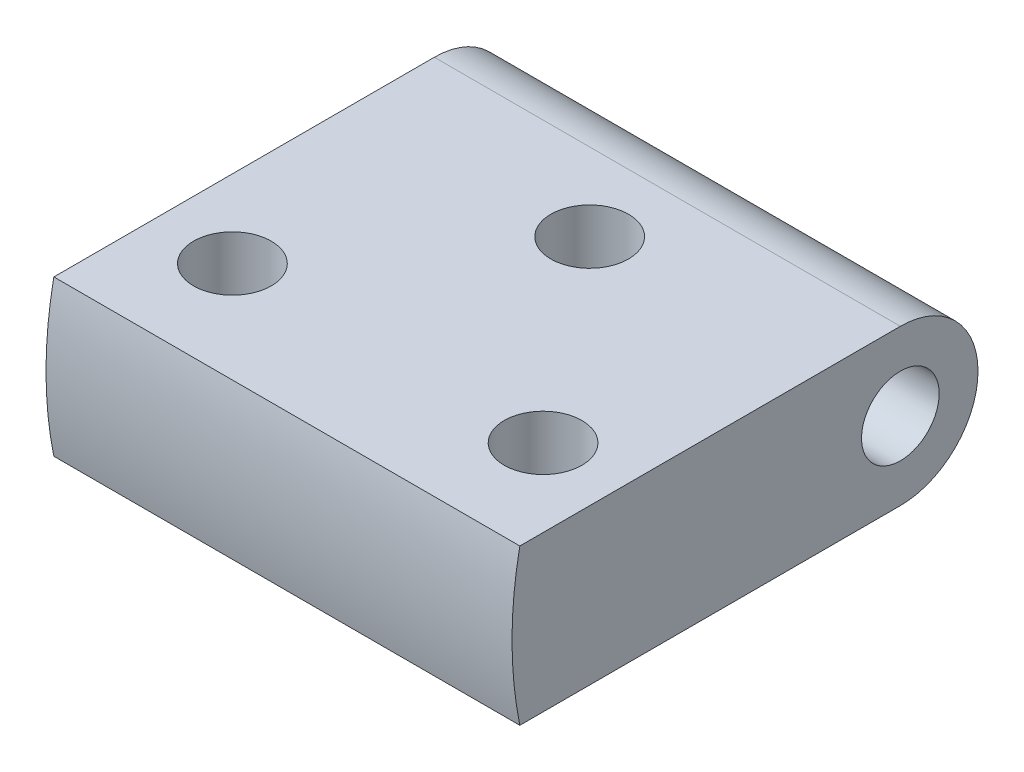
ISO-10303-21;
HEADER;
FILE_DESCRIPTION(('STEP AP214'),'2;1');
FILE_NAME('part.step','',(''),(''),'','','');
FILE_SCHEMA(('AUTOMOTIVE_DESIGN { 1 0 10303 214 1 1 1 1 }'));
ENDSEC;
DATA;
#1=APPLICATION_CONTEXT('core data for automotive mechanical design processes');
#2=APPLICATION_PROTOCOL_DEFINITION('international standard','automotive_design',2000,#1);
#3=PRODUCT_CONTEXT('',#1,'mechanical');
#4=PRODUCT('Part','Part','',(#3));
#5=PRODUCT_RELATED_PRODUCT_CATEGORY('part','',(#4));
#6=PRODUCT_DEFINITION_FORMATION('','',#4);
#7=PRODUCT_DEFINITION_CONTEXT('part definition',#1,'design');
#8=PRODUCT_DEFINITION('design','',#6,#7);
#9=PRODUCT_DEFINITION_SHAPE('','',#8);
#10=(LENGTH_UNIT() NAMED_UNIT(*) SI_UNIT(.MILLI.,.METRE.));
#11=(NAMED_UNIT(*) PLANE_ANGLE_UNIT() SI_UNIT($,.RADIAN.));
#12=(NAMED_UNIT(*) SI_UNIT($,.STERADIAN.) SOLID_ANGLE_UNIT());
#13=UNCERTAINTY_MEASURE_WITH_UNIT(LENGTH_MEASURE(1.E-05),#10,'distance_accuracy_value','');
#14=(GEOMETRIC_REPRESENTATION_CONTEXT(3) GLOBAL_UNCERTAINTY_ASSIGNED_CONTEXT((#13)) GLOBAL_UNIT_ASSIGNED_CONTEXT((#10,
#11,#12)) REPRESENTATION_CONTEXT('',''));
#15=CARTESIAN_POINT('',(0.,0.,0.));
#16=DIRECTION('',(0.,0.,1.));
#17=DIRECTION('',(1.,0.,0.));
#18=AXIS2_PLACEMENT_3D('',#15,#16,#17);
#19=CARTESIAN_POINT('',(15.,10.,15.));
#20=DIRECTION('',(-1.,0.,0.));
#21=DIRECTION('',(0.,0.,1.));
#22=AXIS2_PLACEMENT_3D('',#19,#20,#21);
#23=PLANE('',#22);
#24=CARTESIAN_POINT('',(15.,5.,-10.));
#25=DIRECTION('',(1.,0.,0.));
#26=DIRECTION('',(0.,0.,-1.));
#27=AXIS2_PLACEMENT_3D('',#24,#25,#26);
#28=CIRCLE('',#27,2.5);
#29=CARTESIAN_POINT('',(15.,5.,-12.5));
#30=VERTEX_POINT('',#29);
#31=EDGE_CURVE('E171',#30,#30,#28,.T.);
#32=ORIENTED_EDGE('',*,*,#31,.F.);
#33=EDGE_LOOP('',(#32));
#34=FACE_BOUND('',#33,.T.);
#35=CARTESIAN_POINT('',(15.,5.,-10.));
#36=DIRECTION('',(1.,0.,0.));
#37=DIRECTION('',(0.,0.,-1.));
#38=AXIS2_PLACEMENT_3D('',#35,#36,#37);
#39=CIRCLE('',#38,25.);
#40=CARTESIAN_POINT('',(15.,10.,14.4948974278318));
#41=VERTEX_POINT('',#40);
#42=CARTESIAN_POINT('',(15.,0.,14.4948974278318));
#43=VERTEX_POINT('',#42);
#44=EDGE_CURVE('E76',#41,#43,#39,.T.);
#45=ORIENTED_EDGE('',*,*,#44,.T.);
#46=DIRECTION('',(0.,0.,-1.));
#47=VECTOR('',#46,1.);
#48=CARTESIAN_POINT('',(15.,0.,15.));
#49=LINE('',#48,#47);
#50=CARTESIAN_POINT('',(15.,0.,-10.));
#51=VERTEX_POINT('',#50);
#52=EDGE_CURVE('E123',#43,#51,#49,.T.);
#53=ORIENTED_EDGE('',*,*,#52,.T.);
#54=CARTESIAN_POINT('',(15.,5.,-10.));
#55=DIRECTION('',(-1.,0.,0.));
#56=DIRECTION('',(0.,0.,1.));
#57=AXIS2_PLACEMENT_3D('',#54,#55,#56);
#58=CIRCLE('',#57,5.);
#59=CARTESIAN_POINT('',(15.,5.,-15.));
#60=VERTEX_POINT('',#59);
#61=EDGE_CURVE('E69',#51,#60,#58,.F.);
#62=ORIENTED_EDGE('',*,*,#61,.T.);
#63=CARTESIAN_POINT('',(15.,5.,-10.));
#64=DIRECTION('',(-1.,0.,0.));
#65=DIRECTION('',(0.,0.,1.));
#66=AXIS2_PLACEMENT_3D('',#63,#64,#65);
#67=CIRCLE('',#66,5.);
#68=CARTESIAN_POINT('',(15.,10.,-10.));
#69=VERTEX_POINT('',#68);
#70=EDGE_CURVE('E147',#60,#69,#67,.F.);
#71=ORIENTED_EDGE('',*,*,#70,.T.);
#72=DIRECTION('',(0.,0.,-1.));
#73=VECTOR('',#72,1.);
#74=CARTESIAN_POINT('',(15.,10.,15.));
#75=LINE('',#74,#73);
#76=EDGE_CURVE('E82',#41,#69,#75,.T.);
#77=ORIENTED_EDGE('',*,*,#76,.F.);
#78=EDGE_LOOP('',(#45,#53,#62,#71,#77));
#79=FACE_BOUND('',#78,.T.);
#80=ADVANCED_FACE('F59',(#34,#79),#23,.F.);
#81=CARTESIAN_POINT('',(-15.,10.,15.));
#82=DIRECTION('',(1.,0.,0.));
#83=DIRECTION('',(0.,0.,-1.));
#84=AXIS2_PLACEMENT_3D('',#81,#82,#83);
#85=PLANE('',#84);
#86=CARTESIAN_POINT('',(-15.,5.,-10.));
#87=DIRECTION('',(-1.,0.,0.));
#88=DIRECTION('',(0.,0.,1.));
#89=AXIS2_PLACEMENT_3D('',#86,#87,#88);
#90=CIRCLE('',#89,2.5);
#91=CARTESIAN_POINT('',(-15.,5.,-7.5));
#92=VERTEX_POINT('',#91);
#93=EDGE_CURVE('E322',#92,#92,#90,.T.);
#94=ORIENTED_EDGE('',*,*,#93,.F.);
#95=EDGE_LOOP('',(#94));
#96=FACE_BOUND('',#95,.T.);
#97=DIRECTION('',(0.,0.,1.));
#98=VECTOR('',#97,1.);
#99=CARTESIAN_POINT('',(-15.,0.,15.));
#100=LINE('',#99,#98);
#101=CARTESIAN_POINT('',(-15.,0.,-10.));
#102=VERTEX_POINT('',#101);
#103=CARTESIAN_POINT('',(-15.,0.,14.4948974278318));
#104=VERTEX_POINT('',#103);
#105=EDGE_CURVE('E121',#102,#104,#100,.T.);
#106=ORIENTED_EDGE('',*,*,#105,.T.);
#107=CARTESIAN_POINT('',(-15.,5.,-10.));
#108=DIRECTION('',(1.,0.,0.));
#109=DIRECTION('',(0.,0.,-1.));
#110=AXIS2_PLACEMENT_3D('',#107,#108,#109);
#111=CIRCLE('',#110,25.);
#112=CARTESIAN_POINT('',(-15.,10.,14.4948974278318));
#113=VERTEX_POINT('',#112);
#114=EDGE_CURVE('E105',#113,#104,#111,.T.);
#115=ORIENTED_EDGE('',*,*,#114,.F.);
#116=DIRECTION('',(0.,0.,1.));
#117=VECTOR('',#116,1.);
#118=CARTESIAN_POINT('',(-15.,10.,15.));
#119=LINE('',#118,#117);
#120=CARTESIAN_POINT('',(-15.,10.,-10.));
#121=VERTEX_POINT('',#120);
#122=EDGE_CURVE('E134',#121,#113,#119,.T.);
#123=ORIENTED_EDGE('',*,*,#122,.F.);
#124=CARTESIAN_POINT('',(-15.,5.,-10.));
#125=DIRECTION('',(1.,0.,0.));
#126=DIRECTION('',(0.,0.,-1.));
#127=AXIS2_PLACEMENT_3D('',#124,#125,#126);
#128=CIRCLE('',#127,5.);
#129=CARTESIAN_POINT('',(-15.,5.,-15.));
#130=VERTEX_POINT('',#129);
#131=EDGE_CURVE('E139',#121,#130,#128,.F.);
#132=ORIENTED_EDGE('',*,*,#131,.T.);
#133=CARTESIAN_POINT('',(-15.,5.,-10.));
#134=DIRECTION('',(1.,0.,0.));
#135=DIRECTION('',(0.,0.,-1.));
#136=AXIS2_PLACEMENT_3D('',#133,#134,#135);
#137=CIRCLE('',#136,5.);
#138=EDGE_CURVE('E129',#130,#102,#137,.F.);
#139=ORIENTED_EDGE('',*,*,#138,.T.);
#140=EDGE_LOOP('',(#106,#115,#123,#132,#139));
#141=FACE_BOUND('',#140,.T.);
#142=ADVANCED_FACE('F127',(#96,#141),#85,.F.);
#143=CARTESIAN_POINT('',(0.,0.,0.));
#144=DIRECTION('',(0.,-1.,0.));
#145=DIRECTION('',(0.,0.,-1.));
#146=AXIS2_PLACEMENT_3D('',#143,#144,#145);
#147=PLANE('',#146);
#148=CARTESIAN_POINT('',(-10.,0.,8.));
#149=DIRECTION('',(0.,-1.,0.));
#150=DIRECTION('',(0.,0.,-1.));
#151=AXIS2_PLACEMENT_3D('',#148,#149,#150);
#152=CIRCLE('',#151,2.25);
#153=CARTESIAN_POINT('',(-10.,0.,5.75));
#154=VERTEX_POINT('',#153);
#155=EDGE_CURVE('E193',#154,#154,#152,.T.);
#156=ORIENTED_EDGE('',*,*,#155,.F.);
#157=EDGE_LOOP('',(#156));
#158=FACE_BOUND('',#157,.T.);
#159=CARTESIAN_POINT('',(10.,0.,8.));
#160=DIRECTION('',(0.,-1.,0.));
#161=DIRECTION('',(0.,0.,-1.));
#162=AXIS2_PLACEMENT_3D('',#159,#160,#161);
#163=CIRCLE('',#162,2.25);
#164=CARTESIAN_POINT('',(10.,0.,5.75));
#165=VERTEX_POINT('',#164);
#166=EDGE_CURVE('E209',#165,#165,#163,.T.);
#167=ORIENTED_EDGE('',*,*,#166,.F.);
#168=EDGE_LOOP('',(#167));
#169=FACE_BOUND('',#168,.T.);
#170=CARTESIAN_POINT('',(0.,0.,-5.));
#171=DIRECTION('',(0.,-1.,0.));
#172=DIRECTION('',(0.,0.,-1.));
#173=AXIS2_PLACEMENT_3D('',#170,#171,#172);
#174=CIRCLE('',#173,2.25);
#175=CARTESIAN_POINT('',(0.,0.,-7.25));
#176=VERTEX_POINT('',#175);
#177=EDGE_CURVE('E225',#176,#176,#174,.T.);
#178=ORIENTED_EDGE('',*,*,#177,.F.);
#179=EDGE_LOOP('',(#178));
#180=FACE_BOUND('',#179,.T.);
#181=ORIENTED_EDGE('',*,*,#52,.F.);
#182=DIRECTION('',(1.,0.,0.));
#183=VECTOR('',#182,1.);
#184=CARTESIAN_POINT('',(-15.,0.,14.4948974278318));
#185=LINE('',#184,#183);
#186=EDGE_CURVE('E108',#104,#43,#185,.T.);
#187=ORIENTED_EDGE('',*,*,#186,.F.);
#188=ORIENTED_EDGE('',*,*,#105,.F.);
#189=DIRECTION('',(-1.,0.,0.));
#190=VECTOR('',#189,1.);
#191=CARTESIAN_POINT('',(15.,0.,-10.));
#192=LINE('',#191,#190);
#193=EDGE_CURVE('E144',#102,#51,#192,.F.);
#194=ORIENTED_EDGE('',*,*,#193,.T.);
#195=EDGE_LOOP('',(#181,#187,#188,#194));
#196=FACE_BOUND('',#195,.T.);
#197=ADVANCED_FACE('F119',(#158,#169,#180,#196),#147,.T.);
#198=CARTESIAN_POINT('',(0.,10.,0.));
#199=DIRECTION('',(0.,-1.,0.));
#200=DIRECTION('',(0.,0.,-1.));
#201=AXIS2_PLACEMENT_3D('',#198,#199,#200);
#202=PLANE('',#201);
#203=CARTESIAN_POINT('',(0.,10.,-5.));
#204=DIRECTION('',(0.,1.,0.));
#205=DIRECTION('',(0.,0.,1.));
#206=AXIS2_PLACEMENT_3D('',#203,#204,#205);
#207=CIRCLE('',#206,2.5);
#208=CARTESIAN_POINT('',(0.,10.,-2.5));
#209=VERTEX_POINT('',#208);
#210=EDGE_CURVE('E213',#209,#209,#207,.T.);
#211=ORIENTED_EDGE('',*,*,#210,.F.);
#212=EDGE_LOOP('',(#211));
#213=FACE_BOUND('',#212,.T.);
#214=CARTESIAN_POINT('',(10.,10.,8.));
#215=DIRECTION('',(0.,1.,0.));
#216=DIRECTION('',(0.,0.,1.));
#217=AXIS2_PLACEMENT_3D('',#214,#215,#216);
#218=CIRCLE('',#217,2.5);
#219=CARTESIAN_POINT('',(10.,10.,10.5));
#220=VERTEX_POINT('',#219);
#221=EDGE_CURVE('E197',#220,#220,#218,.T.);
#222=ORIENTED_EDGE('',*,*,#221,.F.);
#223=EDGE_LOOP('',(#222));
#224=FACE_BOUND('',#223,.T.);
#225=CARTESIAN_POINT('',(-10.,10.,8.));
#226=DIRECTION('',(0.,1.,0.));
#227=DIRECTION('',(0.,0.,1.));
#228=AXIS2_PLACEMENT_3D('',#225,#226,#227);
#229=CIRCLE('',#228,2.5);
#230=CARTESIAN_POINT('',(-10.,10.,10.5));
#231=VERTEX_POINT('',#230);
#232=EDGE_CURVE('E177',#231,#231,#229,.T.);
#233=ORIENTED_EDGE('',*,*,#232,.F.);
#234=EDGE_LOOP('',(#233));
#235=FACE_BOUND('',#234,.T.);
#236=DIRECTION('',(1.,0.,0.));
#237=VECTOR('',#236,1.);
#238=CARTESIAN_POINT('',(-15.,10.,14.4948974278318));
#239=LINE('',#238,#237);
#240=EDGE_CURVE('E110',#113,#41,#239,.T.);
#241=ORIENTED_EDGE('',*,*,#240,.T.);
#242=ORIENTED_EDGE('',*,*,#76,.T.);
#243=DIRECTION('',(-1.,0.,0.));
#244=VECTOR('',#243,1.);
#245=CARTESIAN_POINT('',(0.,10.,-10.));
#246=LINE('',#245,#244);
#247=EDGE_CURVE('E12',#69,#121,#246,.T.);
#248=ORIENTED_EDGE('',*,*,#247,.T.);
#249=ORIENTED_EDGE('',*,*,#122,.T.);
#250=EDGE_LOOP('',(#241,#242,#248,#249));
#251=FACE_BOUND('',#250,.T.);
#252=ADVANCED_FACE('F175',(#213,#224,#235,#251),#202,.F.);
#253=CARTESIAN_POINT('',(0.,5.,-10.));
#254=DIRECTION('',(-1.,0.,0.));
#255=DIRECTION('',(0.,0.,1.));
#256=AXIS2_PLACEMENT_3D('',#253,#254,#255);
#257=CYLINDRICAL_SURFACE('',#256,5.);
#258=ORIENTED_EDGE('',*,*,#247,.F.);
#259=ORIENTED_EDGE('',*,*,#70,.F.);
#260=DIRECTION('',(-1.,0.,0.));
#261=VECTOR('',#260,1.);
#262=CARTESIAN_POINT('',(-15.,5.,-15.));
#263=LINE('',#262,#261);
#264=EDGE_CURVE('E63',#130,#60,#263,.F.);
#265=ORIENTED_EDGE('',*,*,#264,.F.);
#266=ORIENTED_EDGE('',*,*,#131,.F.);
#267=EDGE_LOOP('',(#258,#259,#265,#266));
#268=FACE_BOUND('',#267,.T.);
#269=ADVANCED_FACE('F61',(#268),#257,.T.);
#270=CARTESIAN_POINT('',(-15.,5.,-10.));
#271=DIRECTION('',(1.,0.,0.));
#272=DIRECTION('',(0.,0.,-1.));
#273=AXIS2_PLACEMENT_3D('',#270,#271,#272);
#274=CYLINDRICAL_SURFACE('',#273,5.);
#275=ORIENTED_EDGE('',*,*,#61,.F.);
#276=ORIENTED_EDGE('',*,*,#193,.F.);
#277=ORIENTED_EDGE('',*,*,#138,.F.);
#278=ORIENTED_EDGE('',*,*,#264,.T.);
#279=EDGE_LOOP('',(#275,#276,#277,#278));
#280=FACE_BOUND('',#279,.T.);
#281=ADVANCED_FACE('F160',(#280),#274,.T.);
#282=CARTESIAN_POINT('',(15.,5.,-10.));
#283=DIRECTION('',(1.,0.,0.));
#284=DIRECTION('',(0.,0.,-1.));
#285=AXIS2_PLACEMENT_3D('',#282,#283,#284);
#286=CYLINDRICAL_SURFACE('',#285,2.25);
#287=CARTESIAN_POINT('',(-10.8,5.,-10.));
#288=DIRECTION('',(-1.,0.,0.));
#289=DIRECTION('',(0.,0.,1.));
#290=AXIS2_PLACEMENT_3D('',#287,#288,#289);
#291=CIRCLE('',#290,2.25);
#292=CARTESIAN_POINT('',(-10.8,5.,-7.74999999999999));
#293=VERTEX_POINT('',#292);
#294=EDGE_CURVE('E125',#293,#293,#291,.T.);
#295=ORIENTED_EDGE('',*,*,#294,.T.);
#296=EDGE_LOOP('',(#295));
#297=FACE_BOUND('',#296,.T.);
#298=CARTESIAN_POINT('',(10.8,5.,-10.));
#299=DIRECTION('',(1.,0.,0.));
#300=DIRECTION('',(0.,0.,-1.));
#301=AXIS2_PLACEMENT_3D('',#298,#299,#300);
#302=CIRCLE('',#301,2.25);
#303=CARTESIAN_POINT('',(10.8,5.,-12.25));
#304=VERTEX_POINT('',#303);
#305=EDGE_CURVE('E162',#304,#304,#302,.T.);
#306=ORIENTED_EDGE('',*,*,#305,.T.);
#307=EDGE_LOOP('',(#306));
#308=FACE_BOUND('',#307,.T.);
#309=ADVANCED_FACE('F243',(#297,#308),#286,.F.);
#310=CARTESIAN_POINT('',(10.8,7.25,-10.));
#311=DIRECTION('',(-1.,0.,0.));
#312=DIRECTION('',(0.,0.,1.));
#313=AXIS2_PLACEMENT_3D('',#310,#311,#312);
#314=PLANE('',#313);
#315=ORIENTED_EDGE('',*,*,#305,.F.);
#316=EDGE_LOOP('',(#315));
#317=FACE_BOUND('',#316,.T.);
#318=CARTESIAN_POINT('',(10.8,5.,-10.));
#319=DIRECTION('',(1.,0.,0.));
#320=DIRECTION('',(0.,0.,-1.));
#321=AXIS2_PLACEMENT_3D('',#318,#319,#320);
#322=CIRCLE('',#321,2.5);
#323=CARTESIAN_POINT('',(10.8,5.,-12.5));
#324=VERTEX_POINT('',#323);
#325=EDGE_CURVE('E165',#324,#324,#322,.T.);
#326=ORIENTED_EDGE('',*,*,#325,.T.);
#327=EDGE_LOOP('',(#326));
#328=FACE_BOUND('',#327,.T.);
#329=ADVANCED_FACE('F248',(#317,#328),#314,.F.);
#330=CARTESIAN_POINT('',(15.,5.,-10.));
#331=DIRECTION('',(1.,0.,0.));
#332=DIRECTION('',(0.,0.,-1.));
#333=AXIS2_PLACEMENT_3D('',#330,#331,#332);
#334=CYLINDRICAL_SURFACE('',#333,2.5);
#335=ORIENTED_EDGE('',*,*,#325,.F.);
#336=EDGE_LOOP('',(#335));
#337=FACE_BOUND('',#336,.T.);
#338=ORIENTED_EDGE('',*,*,#31,.T.);
#339=EDGE_LOOP('',(#338));
#340=FACE_BOUND('',#339,.T.);
#341=ADVANCED_FACE('F232',(#337,#340),#334,.F.);
#342=CARTESIAN_POINT('',(0.,10.,-5.));
#343=DIRECTION('',(0.,1.,0.));
#344=DIRECTION('',(0.,0.,1.));
#345=AXIS2_PLACEMENT_3D('',#342,#343,#344);
#346=CYLINDRICAL_SURFACE('',#345,2.25);
#347=CARTESIAN_POINT('',(0.,5.8,-5.));
#348=DIRECTION('',(0.,1.,0.));
#349=DIRECTION('',(0.,0.,1.));
#350=AXIS2_PLACEMENT_3D('',#347,#348,#349);
#351=CIRCLE('',#350,2.25);
#352=CARTESIAN_POINT('',(0.,5.8,-2.75));
#353=VERTEX_POINT('',#352);
#354=EDGE_CURVE('E221',#353,#353,#351,.T.);
#355=ORIENTED_EDGE('',*,*,#354,.T.);
#356=EDGE_LOOP('',(#355));
#357=FACE_BOUND('',#356,.T.);
#358=ORIENTED_EDGE('',*,*,#177,.T.);
#359=EDGE_LOOP('',(#358));
#360=FACE_BOUND('',#359,.T.);
#361=ADVANCED_FACE('F268',(#357,#360),#346,.F.);
#362=CARTESIAN_POINT('',(2.25,5.8,-5.));
#363=DIRECTION('',(0.,-1.,0.));
#364=DIRECTION('',(0.,0.,-1.));
#365=AXIS2_PLACEMENT_3D('',#362,#363,#364);
#366=PLANE('',#365);
#367=ORIENTED_EDGE('',*,*,#354,.F.);
#368=EDGE_LOOP('',(#367));
#369=FACE_BOUND('',#368,.T.);
#370=CARTESIAN_POINT('',(0.,5.8,-5.));
#371=DIRECTION('',(0.,1.,0.));
#372=DIRECTION('',(0.,0.,1.));
#373=AXIS2_PLACEMENT_3D('',#370,#371,#372);
#374=CIRCLE('',#373,2.5);
#375=CARTESIAN_POINT('',(0.,5.8,-2.5));
#376=VERTEX_POINT('',#375);
#377=EDGE_CURVE('E217',#376,#376,#374,.T.);
#378=ORIENTED_EDGE('',*,*,#377,.T.);
#379=EDGE_LOOP('',(#378));
#380=FACE_BOUND('',#379,.T.);
#381=ADVANCED_FACE('F272',(#369,#380),#366,.F.);
#382=CARTESIAN_POINT('',(0.,10.,-5.));
#383=DIRECTION('',(0.,1.,0.));
#384=DIRECTION('',(0.,0.,1.));
#385=AXIS2_PLACEMENT_3D('',#382,#383,#384);
#386=CYLINDRICAL_SURFACE('',#385,2.5);
#387=ORIENTED_EDGE('',*,*,#377,.F.);
#388=EDGE_LOOP('',(#387));
#389=FACE_BOUND('',#388,.T.);
#390=ORIENTED_EDGE('',*,*,#210,.T.);
#391=EDGE_LOOP('',(#390));
#392=FACE_BOUND('',#391,.T.);
#393=ADVANCED_FACE('F276',(#389,#392),#386,.F.);
#394=CARTESIAN_POINT('',(10.,10.,8.));
#395=DIRECTION('',(0.,1.,0.));
#396=DIRECTION('',(0.,0.,1.));
#397=AXIS2_PLACEMENT_3D('',#394,#395,#396);
#398=CYLINDRICAL_SURFACE('',#397,2.25);
#399=CARTESIAN_POINT('',(10.,5.8,8.));
#400=DIRECTION('',(0.,1.,0.));
#401=DIRECTION('',(0.,0.,1.));
#402=AXIS2_PLACEMENT_3D('',#399,#400,#401);
#403=CIRCLE('',#402,2.25);
#404=CARTESIAN_POINT('',(10.,5.8,10.25));
#405=VERTEX_POINT('',#404);
#406=EDGE_CURVE('E205',#405,#405,#403,.T.);
#407=ORIENTED_EDGE('',*,*,#406,.T.);
#408=EDGE_LOOP('',(#407));
#409=FACE_BOUND('',#408,.T.);
#410=ORIENTED_EDGE('',*,*,#166,.T.);
#411=EDGE_LOOP('',(#410));
#412=FACE_BOUND('',#411,.T.);
#413=ADVANCED_FACE('F280',(#409,#412),#398,.F.);
#414=CARTESIAN_POINT('',(12.25,5.8,8.));
#415=DIRECTION('',(0.,-1.,0.));
#416=DIRECTION('',(0.,0.,-1.));
#417=AXIS2_PLACEMENT_3D('',#414,#415,#416);
#418=PLANE('',#417);
#419=ORIENTED_EDGE('',*,*,#406,.F.);
#420=EDGE_LOOP('',(#419));
#421=FACE_BOUND('',#420,.T.);
#422=CARTESIAN_POINT('',(10.,5.8,8.));
#423=DIRECTION('',(0.,1.,0.));
#424=DIRECTION('',(0.,0.,1.));
#425=AXIS2_PLACEMENT_3D('',#422,#423,#424);
#426=CIRCLE('',#425,2.5);
#427=CARTESIAN_POINT('',(10.,5.8,10.5));
#428=VERTEX_POINT('',#427);
#429=EDGE_CURVE('E201',#428,#428,#426,.T.);
#430=ORIENTED_EDGE('',*,*,#429,.T.);
#431=EDGE_LOOP('',(#430));
#432=FACE_BOUND('',#431,.T.);
#433=ADVANCED_FACE('F284',(#421,#432),#418,.F.);
#434=CARTESIAN_POINT('',(10.,10.,8.));
#435=DIRECTION('',(0.,1.,0.));
#436=DIRECTION('',(0.,0.,1.));
#437=AXIS2_PLACEMENT_3D('',#434,#435,#436);
#438=CYLINDRICAL_SURFACE('',#437,2.5);
#439=ORIENTED_EDGE('',*,*,#429,.F.);
#440=EDGE_LOOP('',(#439));
#441=FACE_BOUND('',#440,.T.);
#442=ORIENTED_EDGE('',*,*,#221,.T.);
#443=EDGE_LOOP('',(#442));
#444=FACE_BOUND('',#443,.T.);
#445=ADVANCED_FACE('F288',(#441,#444),#438,.F.);
#446=CARTESIAN_POINT('',(-10.,10.,8.));
#447=DIRECTION('',(0.,1.,0.));
#448=DIRECTION('',(0.,0.,1.));
#449=AXIS2_PLACEMENT_3D('',#446,#447,#448);
#450=CYLINDRICAL_SURFACE('',#449,2.25);
#451=CARTESIAN_POINT('',(-10.,5.8,8.));
#452=DIRECTION('',(0.,1.,0.));
#453=DIRECTION('',(0.,0.,1.));
#454=AXIS2_PLACEMENT_3D('',#451,#452,#453);
#455=CIRCLE('',#454,2.25);
#456=CARTESIAN_POINT('',(-10.,5.8,10.25));
#457=VERTEX_POINT('',#456);
#458=EDGE_CURVE('E189',#457,#457,#455,.T.);
#459=ORIENTED_EDGE('',*,*,#458,.T.);
#460=EDGE_LOOP('',(#459));
#461=FACE_BOUND('',#460,.T.);
#462=ORIENTED_EDGE('',*,*,#155,.T.);
#463=EDGE_LOOP('',(#462));
#464=FACE_BOUND('',#463,.T.);
#465=ADVANCED_FACE('F292',(#461,#464),#450,.F.);
#466=CARTESIAN_POINT('',(-7.75,5.8,8.));
#467=DIRECTION('',(0.,-1.,0.));
#468=DIRECTION('',(0.,0.,-1.));
#469=AXIS2_PLACEMENT_3D('',#466,#467,#468);
#470=PLANE('',#469);
#471=ORIENTED_EDGE('',*,*,#458,.F.);
#472=EDGE_LOOP('',(#471));
#473=FACE_BOUND('',#472,.T.);
#474=CARTESIAN_POINT('',(-10.,5.8,8.));
#475=DIRECTION('',(0.,1.,0.));
#476=DIRECTION('',(0.,0.,1.));
#477=AXIS2_PLACEMENT_3D('',#474,#475,#476);
#478=CIRCLE('',#477,2.5);
#479=CARTESIAN_POINT('',(-10.,5.8,10.5));
#480=VERTEX_POINT('',#479);
#481=EDGE_CURVE('E185',#480,#480,#478,.T.);
#482=ORIENTED_EDGE('',*,*,#481,.T.);
#483=EDGE_LOOP('',(#482));
#484=FACE_BOUND('',#483,.T.);
#485=ADVANCED_FACE('F296',(#473,#484),#470,.F.);
#486=CARTESIAN_POINT('',(-10.,10.,8.));
#487=DIRECTION('',(0.,1.,0.));
#488=DIRECTION('',(0.,0.,1.));
#489=AXIS2_PLACEMENT_3D('',#486,#487,#488);
#490=CYLINDRICAL_SURFACE('',#489,2.5);
#491=ORIENTED_EDGE('',*,*,#481,.F.);
#492=EDGE_LOOP('',(#491));
#493=FACE_BOUND('',#492,.T.);
#494=ORIENTED_EDGE('',*,*,#232,.T.);
#495=EDGE_LOOP('',(#494));
#496=FACE_BOUND('',#495,.T.);
#497=ADVANCED_FACE('F300',(#493,#496),#490,.F.);
#498=CARTESIAN_POINT('',(-15.,5.,-10.));
#499=DIRECTION('',(1.,0.,0.));
#500=DIRECTION('',(0.,0.,-1.));
#501=AXIS2_PLACEMENT_3D('',#498,#499,#500);
#502=CYLINDRICAL_SURFACE('',#501,25.);
#503=ORIENTED_EDGE('',*,*,#44,.F.);
#504=ORIENTED_EDGE('',*,*,#240,.F.);
#505=ORIENTED_EDGE('',*,*,#114,.T.);
#506=ORIENTED_EDGE('',*,*,#186,.T.);
#507=EDGE_LOOP('',(#503,#504,#505,#506));
#508=FACE_BOUND('',#507,.T.);
#509=ADVANCED_FACE('F107',(#508),#502,.T.);
#510=CARTESIAN_POINT('',(-10.8,7.25,-10.));
#511=DIRECTION('',(1.,0.,0.));
#512=DIRECTION('',(0.,0.,-1.));
#513=AXIS2_PLACEMENT_3D('',#510,#511,#512);
#514=PLANE('',#513);
#515=ORIENTED_EDGE('',*,*,#294,.F.);
#516=EDGE_LOOP('',(#515));
#517=FACE_BOUND('',#516,.T.);
#518=CARTESIAN_POINT('',(-10.8,5.,-10.));
#519=DIRECTION('',(-1.,0.,0.));
#520=DIRECTION('',(0.,0.,1.));
#521=AXIS2_PLACEMENT_3D('',#518,#519,#520);
#522=CIRCLE('',#521,2.5);
#523=CARTESIAN_POINT('',(-10.8,5.,-7.5));
#524=VERTEX_POINT('',#523);
#525=EDGE_CURVE('E319',#524,#524,#522,.T.);
#526=ORIENTED_EDGE('',*,*,#525,.T.);
#527=EDGE_LOOP('',(#526));
#528=FACE_BOUND('',#527,.T.);
#529=ADVANCED_FACE('F307',(#517,#528),#514,.F.);
#530=CARTESIAN_POINT('',(-15.,5.,-10.));
#531=DIRECTION('',(-1.,0.,0.));
#532=DIRECTION('',(0.,0.,1.));
#533=AXIS2_PLACEMENT_3D('',#530,#531,#532);
#534=CYLINDRICAL_SURFACE('',#533,2.5);
#535=ORIENTED_EDGE('',*,*,#525,.F.);
#536=EDGE_LOOP('',(#535));
#537=FACE_BOUND('',#536,.T.);
#538=ORIENTED_EDGE('',*,*,#93,.T.);
#539=EDGE_LOOP('',(#538));
#540=FACE_BOUND('',#539,.T.);
#541=ADVANCED_FACE('F310',(#537,#540),#534,.F.);
#542=CLOSED_SHELL('',(#80,#142,#197,#252,#269,#281,#309,#329,#341,#361,#381,#393,#413,#433,#445,
#465,#485,#497,#509,#529,#541));
#543=MANIFOLD_SOLID_BREP('B2',#542);
#544=ADVANCED_BREP_SHAPE_REPRESENTATION('',(#18,#543),#14);
#545=SHAPE_DEFINITION_REPRESENTATION(#9,#544);
ENDSEC;
END-ISO-10303-21;
